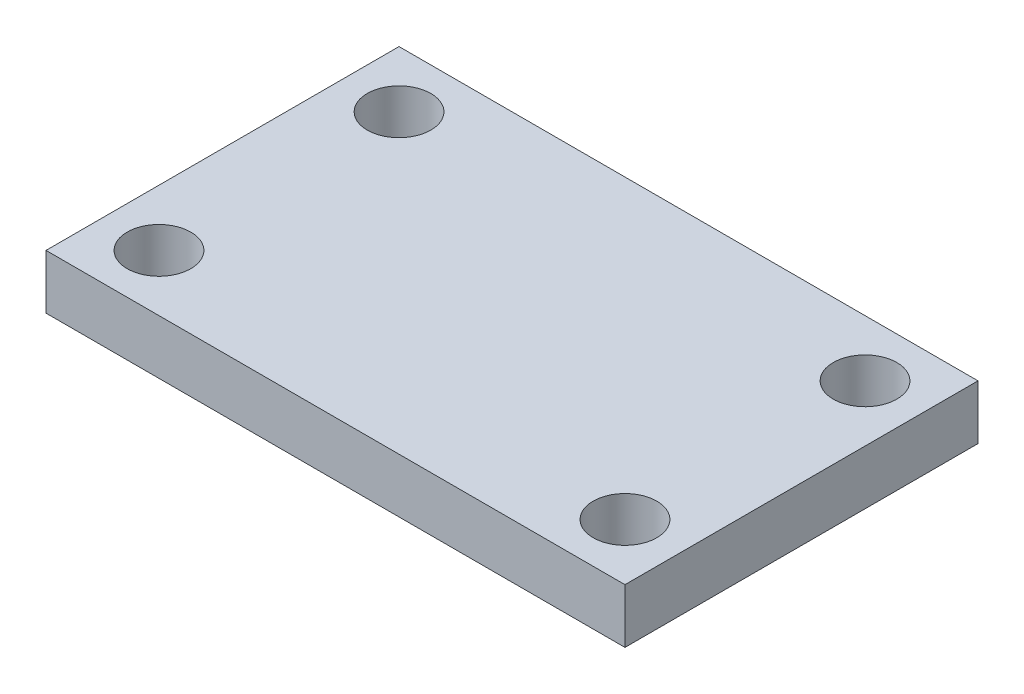
ISO-10303-21;
HEADER;
FILE_DESCRIPTION(('STEP AP214'),'2;1');
FILE_NAME('part.step','',(''),(''),'','','');
FILE_SCHEMA(('AUTOMOTIVE_DESIGN { 1 0 10303 214 1 1 1 1 }'));
ENDSEC;
DATA;
#1=APPLICATION_CONTEXT('core data for automotive mechanical design processes');
#2=APPLICATION_PROTOCOL_DEFINITION('international standard','automotive_design',2000,#1);
#3=PRODUCT_CONTEXT('',#1,'mechanical');
#4=PRODUCT('Part','Part','',(#3));
#5=PRODUCT_RELATED_PRODUCT_CATEGORY('part','',(#4));
#6=PRODUCT_DEFINITION_FORMATION('','',#4);
#7=PRODUCT_DEFINITION_CONTEXT('part definition',#1,'design');
#8=PRODUCT_DEFINITION('design','',#6,#7);
#9=PRODUCT_DEFINITION_SHAPE('','',#8);
#10=(LENGTH_UNIT() NAMED_UNIT(*) SI_UNIT(.MILLI.,.METRE.));
#11=(NAMED_UNIT(*) PLANE_ANGLE_UNIT() SI_UNIT($,.RADIAN.));
#12=(NAMED_UNIT(*) SI_UNIT($,.STERADIAN.) SOLID_ANGLE_UNIT());
#13=UNCERTAINTY_MEASURE_WITH_UNIT(LENGTH_MEASURE(1.E-05),#10,'distance_accuracy_value','');
#14=(GEOMETRIC_REPRESENTATION_CONTEXT(3) GLOBAL_UNCERTAINTY_ASSIGNED_CONTEXT((#13)) GLOBAL_UNIT_ASSIGNED_CONTEXT((#10,
#11,#12)) REPRESENTATION_CONTEXT('',''));
#15=CARTESIAN_POINT('',(0.,0.,0.));
#16=DIRECTION('',(0.,0.,1.));
#17=DIRECTION('',(1.,0.,0.));
#18=AXIS2_PLACEMENT_3D('',#15,#16,#17);
#19=CARTESIAN_POINT('',(-142.584347611488,-317.589072168843,-382.8876));
#20=DIRECTION('',(0.,-1.,0.));
#21=DIRECTION('',(0.,0.,-1.));
#22=AXIS2_PLACEMENT_3D('',#19,#20,#21);
#23=PLANE('',#22);
#24=DIRECTION('',(0.,0.,1.));
#25=VECTOR('',#24,1.);
#26=CARTESIAN_POINT('',(-103.661847611488,-317.589072168843,-506.1739));
#27=LINE('',#26,#25);
#28=CARTESIAN_POINT('',(-103.661847611488,-317.589072168843,-506.1739));
#29=VERTEX_POINT('',#28);
#30=CARTESIAN_POINT('',(-103.661847611488,-317.589072168843,-556.1739));
#31=VERTEX_POINT('',#30);
#32=EDGE_CURVE('E72',#29,#31,#27,.F.);
#33=ORIENTED_EDGE('',*,*,#32,.F.);
#34=DIRECTION('',(1.,0.,0.));
#35=VECTOR('',#34,1.);
#36=CARTESIAN_POINT('',(-21.6618476114882,-317.589072168843,-506.1739));
#37=LINE('',#36,#35);
#38=CARTESIAN_POINT('',(-21.6618476114881,-317.589072168843,-506.1739));
#39=VERTEX_POINT('',#38);
#40=EDGE_CURVE('E55',#39,#29,#37,.F.);
#41=ORIENTED_EDGE('',*,*,#40,.F.);
#42=DIRECTION('',(0.,0.,-1.));
#43=VECTOR('',#42,1.);
#44=CARTESIAN_POINT('',(-21.6618476114881,-317.589072168843,-556.1739));
#45=LINE('',#44,#43);
#46=CARTESIAN_POINT('',(-21.6618476114881,-317.589072168843,-556.1739));
#47=VERTEX_POINT('',#46);
#48=EDGE_CURVE('E60',#47,#39,#45,.F.);
#49=ORIENTED_EDGE('',*,*,#48,.F.);
#50=DIRECTION('',(1.,0.,0.));
#51=VECTOR('',#50,1.);
#52=CARTESIAN_POINT('',(-103.661847611488,-317.589072168843,-556.1739));
#53=LINE('',#52,#51);
#54=EDGE_CURVE('E223',#31,#47,#53,.T.);
#55=ORIENTED_EDGE('',*,*,#54,.F.);
#56=EDGE_LOOP('',(#33,#41,#49,#55));
#57=FACE_BOUND('',#56,.T.);
#58=CARTESIAN_POINT('',(-29.6618476114882,-317.589072168843,-514.1739));
#59=DIRECTION('',(0.,-1.,0.));
#60=DIRECTION('',(0.,0.,-1.));
#61=AXIS2_PLACEMENT_3D('',#58,#59,#60);
#62=CIRCLE('',#61,4.5);
#63=CARTESIAN_POINT('',(-29.6618476114882,-317.589072168843,-518.6739));
#64=VERTEX_POINT('',#63);
#65=EDGE_CURVE('E69',#64,#64,#62,.T.);
#66=ORIENTED_EDGE('',*,*,#65,.T.);
#67=EDGE_LOOP('',(#66));
#68=FACE_BOUND('',#67,.T.);
#69=CARTESIAN_POINT('',(-95.6618476114882,-317.589072168843,-514.1739));
#70=DIRECTION('',(0.,-1.,0.));
#71=DIRECTION('',(0.,0.,-1.));
#72=AXIS2_PLACEMENT_3D('',#69,#70,#71);
#73=CIRCLE('',#72,4.5);
#74=CARTESIAN_POINT('',(-95.6618476114882,-317.589072168843,-518.6739));
#75=VERTEX_POINT('',#74);
#76=EDGE_CURVE('E98',#75,#75,#73,.T.);
#77=ORIENTED_EDGE('',*,*,#76,.T.);
#78=EDGE_LOOP('',(#77));
#79=FACE_BOUND('',#78,.T.);
#80=CARTESIAN_POINT('',(-95.6618476114881,-317.589072168843,-548.1739));
#81=DIRECTION('',(0.,-1.,0.));
#82=DIRECTION('',(0.,0.,-1.));
#83=AXIS2_PLACEMENT_3D('',#80,#81,#82);
#84=CIRCLE('',#83,4.5);
#85=CARTESIAN_POINT('',(-95.6618476114881,-317.589072168843,-552.6739));
#86=VERTEX_POINT('',#85);
#87=EDGE_CURVE('E100',#86,#86,#84,.T.);
#88=ORIENTED_EDGE('',*,*,#87,.T.);
#89=EDGE_LOOP('',(#88));
#90=FACE_BOUND('',#89,.T.);
#91=CARTESIAN_POINT('',(-29.6618476114881,-317.589072168843,-548.1739));
#92=DIRECTION('',(0.,-1.,0.));
#93=DIRECTION('',(0.,0.,-1.));
#94=AXIS2_PLACEMENT_3D('',#91,#92,#93);
#95=CIRCLE('',#94,4.5);
#96=CARTESIAN_POINT('',(-29.6618476114881,-317.589072168843,-552.6739));
#97=VERTEX_POINT('',#96);
#98=EDGE_CURVE('E20',#97,#97,#95,.T.);
#99=ORIENTED_EDGE('',*,*,#98,.T.);
#100=EDGE_LOOP('',(#99));
#101=FACE_BOUND('',#100,.T.);
#102=ADVANCED_FACE('F17',(#57,#68,#79,#90,#101),#23,.F.);
#103=CARTESIAN_POINT('',(-29.6618476114881,-321.310072168843,-548.1739));
#104=DIRECTION('',(0.,-1.,0.));
#105=DIRECTION('',(0.,0.,-1.));
#106=AXIS2_PLACEMENT_3D('',#103,#104,#105);
#107=CYLINDRICAL_SURFACE('',#106,4.5);
#108=CARTESIAN_POINT('',(-29.6618476114881,-325.289072168843,-548.1739));
#109=DIRECTION('',(0.,-1.,0.));
#110=DIRECTION('',(0.,0.,-1.));
#111=AXIS2_PLACEMENT_3D('',#108,#109,#110);
#112=CIRCLE('',#111,4.5);
#113=CARTESIAN_POINT('',(-29.6618476114881,-325.289072168843,-552.6739));
#114=VERTEX_POINT('',#113);
#115=EDGE_CURVE('E93',#114,#114,#112,.F.);
#116=ORIENTED_EDGE('',*,*,#115,.F.);
#117=EDGE_LOOP('',(#116));
#118=FACE_BOUND('',#117,.T.);
#119=ORIENTED_EDGE('',*,*,#98,.F.);
#120=EDGE_LOOP('',(#119));
#121=FACE_BOUND('',#120,.T.);
#122=ADVANCED_FACE('F108',(#118,#121),#107,.F.);
#123=CARTESIAN_POINT('',(-95.6618476114881,-321.310072168843,-548.1739));
#124=DIRECTION('',(0.,-1.,0.));
#125=DIRECTION('',(0.,0.,-1.));
#126=AXIS2_PLACEMENT_3D('',#123,#124,#125);
#127=CYLINDRICAL_SURFACE('',#126,4.5);
#128=CARTESIAN_POINT('',(-95.6618476114881,-325.289072168843,-548.1739));
#129=DIRECTION('',(0.,-1.,0.));
#130=DIRECTION('',(0.,0.,-1.));
#131=AXIS2_PLACEMENT_3D('',#128,#129,#130);
#132=CIRCLE('',#131,4.5);
#133=CARTESIAN_POINT('',(-95.6618476114881,-325.289072168843,-552.6739));
#134=VERTEX_POINT('',#133);
#135=EDGE_CURVE('E90',#134,#134,#132,.F.);
#136=ORIENTED_EDGE('',*,*,#135,.F.);
#137=EDGE_LOOP('',(#136));
#138=FACE_BOUND('',#137,.T.);
#139=ORIENTED_EDGE('',*,*,#87,.F.);
#140=EDGE_LOOP('',(#139));
#141=FACE_BOUND('',#140,.T.);
#142=ADVANCED_FACE('F110',(#138,#141),#127,.F.);
#143=CARTESIAN_POINT('',(-95.6618476114882,-321.310072168843,-514.1739));
#144=DIRECTION('',(0.,-1.,0.));
#145=DIRECTION('',(0.,0.,-1.));
#146=AXIS2_PLACEMENT_3D('',#143,#144,#145);
#147=CYLINDRICAL_SURFACE('',#146,4.5);
#148=CARTESIAN_POINT('',(-95.6618476114882,-325.289072168843,-514.1739));
#149=DIRECTION('',(0.,-1.,0.));
#150=DIRECTION('',(0.,0.,-1.));
#151=AXIS2_PLACEMENT_3D('',#148,#149,#150);
#152=CIRCLE('',#151,4.5);
#153=CARTESIAN_POINT('',(-95.6618476114882,-325.289072168843,-518.6739));
#154=VERTEX_POINT('',#153);
#155=EDGE_CURVE('E87',#154,#154,#152,.F.);
#156=ORIENTED_EDGE('',*,*,#155,.F.);
#157=EDGE_LOOP('',(#156));
#158=FACE_BOUND('',#157,.T.);
#159=ORIENTED_EDGE('',*,*,#76,.F.);
#160=EDGE_LOOP('',(#159));
#161=FACE_BOUND('',#160,.T.);
#162=ADVANCED_FACE('F117',(#158,#161),#147,.F.);
#163=CARTESIAN_POINT('',(-29.6618476114882,-321.310072168843,-514.1739));
#164=DIRECTION('',(0.,-1.,0.));
#165=DIRECTION('',(0.,0.,-1.));
#166=AXIS2_PLACEMENT_3D('',#163,#164,#165);
#167=CYLINDRICAL_SURFACE('',#166,4.5);
#168=ORIENTED_EDGE('',*,*,#65,.F.);
#169=EDGE_LOOP('',(#168));
#170=FACE_BOUND('',#169,.T.);
#171=CARTESIAN_POINT('',(-29.6618476114882,-325.289072168843,-514.1739));
#172=DIRECTION('',(0.,-1.,0.));
#173=DIRECTION('',(0.,0.,-1.));
#174=AXIS2_PLACEMENT_3D('',#171,#172,#173);
#175=CIRCLE('',#174,4.5);
#176=CARTESIAN_POINT('',(-29.6618476114882,-325.289072168843,-518.6739));
#177=VERTEX_POINT('',#176);
#178=EDGE_CURVE('E83',#177,#177,#175,.F.);
#179=ORIENTED_EDGE('',*,*,#178,.F.);
#180=EDGE_LOOP('',(#179));
#181=FACE_BOUND('',#180,.T.);
#182=ADVANCED_FACE('F141',(#170,#181),#167,.F.);
#183=CARTESIAN_POINT('',(-21.6618476114881,-321.310072168843,-556.1739));
#184=DIRECTION('',(1.,0.,0.));
#185=DIRECTION('',(0.,0.,-1.));
#186=AXIS2_PLACEMENT_3D('',#183,#184,#185);
#187=PLANE('',#186);
#188=ORIENTED_EDGE('',*,*,#48,.T.);
#189=DIRECTION('',(0.,-1.,0.));
#190=VECTOR('',#189,1.);
#191=CARTESIAN_POINT('',(-21.6618476114882,-321.310072168843,-506.1739));
#192=LINE('',#191,#190);
#193=CARTESIAN_POINT('',(-21.6618476114881,-325.289072168843,-506.1739));
#194=VERTEX_POINT('',#193);
#195=EDGE_CURVE('E62',#194,#39,#192,.F.);
#196=ORIENTED_EDGE('',*,*,#195,.F.);
#197=DIRECTION('',(0.,0.,-1.));
#198=VECTOR('',#197,1.);
#199=CARTESIAN_POINT('',(-21.6618476114881,-325.289072168843,-135.95));
#200=LINE('',#199,#198);
#201=CARTESIAN_POINT('',(-21.6618476114881,-325.289072168843,-556.1739));
#202=VERTEX_POINT('',#201);
#203=EDGE_CURVE('E86',#202,#194,#200,.F.);
#204=ORIENTED_EDGE('',*,*,#203,.F.);
#205=DIRECTION('',(0.,1.,0.));
#206=VECTOR('',#205,1.);
#207=CARTESIAN_POINT('',(-21.6618476114881,-321.310072168843,-556.1739));
#208=LINE('',#207,#206);
#209=EDGE_CURVE('E65',#47,#202,#208,.F.);
#210=ORIENTED_EDGE('',*,*,#209,.F.);
#211=EDGE_LOOP('',(#188,#196,#204,#210));
#212=FACE_BOUND('',#211,.T.);
#213=ADVANCED_FACE('F61',(#212),#187,.T.);
#214=CARTESIAN_POINT('',(-21.6618476114882,-321.310072168843,-506.1739));
#215=DIRECTION('',(0.,0.,1.));
#216=DIRECTION('',(0.,-1.,0.));
#217=AXIS2_PLACEMENT_3D('',#214,#215,#216);
#218=PLANE('',#217);
#219=ORIENTED_EDGE('',*,*,#40,.T.);
#220=DIRECTION('',(0.,1.,0.));
#221=VECTOR('',#220,1.);
#222=CARTESIAN_POINT('',(-103.661847611488,-321.310072168843,-506.1739));
#223=LINE('',#222,#221);
#224=CARTESIAN_POINT('',(-103.661847611488,-325.289072168843,-506.1739));
#225=VERTEX_POINT('',#224);
#226=EDGE_CURVE('E74',#225,#29,#223,.T.);
#227=ORIENTED_EDGE('',*,*,#226,.F.);
#228=DIRECTION('',(1.,0.,0.));
#229=VECTOR('',#228,1.);
#230=CARTESIAN_POINT('',(-173.489347611488,-325.289072168843,-506.1739));
#231=LINE('',#230,#229);
#232=EDGE_CURVE('E78',#194,#225,#231,.F.);
#233=ORIENTED_EDGE('',*,*,#232,.F.);
#234=ORIENTED_EDGE('',*,*,#195,.T.);
#235=EDGE_LOOP('',(#219,#227,#233,#234));
#236=FACE_BOUND('',#235,.T.);
#237=ADVANCED_FACE('F76',(#236),#218,.T.);
#238=CARTESIAN_POINT('',(-103.661847611488,-321.310072168843,-506.1739));
#239=DIRECTION('',(-1.,0.,0.));
#240=DIRECTION('',(0.,0.,1.));
#241=AXIS2_PLACEMENT_3D('',#238,#239,#240);
#242=PLANE('',#241);
#243=ORIENTED_EDGE('',*,*,#32,.T.);
#244=DIRECTION('',(0.,1.,0.));
#245=VECTOR('',#244,1.);
#246=CARTESIAN_POINT('',(-103.661847611488,-321.310072168843,-556.1739));
#247=LINE('',#246,#245);
#248=CARTESIAN_POINT('',(-103.661847611488,-325.289072168843,-556.1739));
#249=VERTEX_POINT('',#248);
#250=EDGE_CURVE('E35',#249,#31,#247,.T.);
#251=ORIENTED_EDGE('',*,*,#250,.F.);
#252=DIRECTION('',(0.,0.,-1.));
#253=VECTOR('',#252,1.);
#254=CARTESIAN_POINT('',(-103.661847611488,-325.289072168843,-135.95));
#255=LINE('',#254,#253);
#256=EDGE_CURVE('E26',#225,#249,#255,.T.);
#257=ORIENTED_EDGE('',*,*,#256,.F.);
#258=ORIENTED_EDGE('',*,*,#226,.T.);
#259=EDGE_LOOP('',(#243,#251,#257,#258));
#260=FACE_BOUND('',#259,.T.);
#261=ADVANCED_FACE('F129',(#260),#242,.T.);
#262=CARTESIAN_POINT('',(-103.661847611488,-321.310072168843,-556.1739));
#263=DIRECTION('',(0.,0.,-1.));
#264=DIRECTION('',(0.,1.,0.));
#265=AXIS2_PLACEMENT_3D('',#262,#263,#264);
#266=PLANE('',#265);
#267=ORIENTED_EDGE('',*,*,#54,.T.);
#268=ORIENTED_EDGE('',*,*,#209,.T.);
#269=DIRECTION('',(1.,0.,0.));
#270=VECTOR('',#269,1.);
#271=CARTESIAN_POINT('',(-173.489347611488,-325.289072168843,-556.1739));
#272=LINE('',#271,#270);
#273=EDGE_CURVE('E11',#249,#202,#272,.T.);
#274=ORIENTED_EDGE('',*,*,#273,.F.);
#275=ORIENTED_EDGE('',*,*,#250,.T.);
#276=EDGE_LOOP('',(#267,#268,#274,#275));
#277=FACE_BOUND('',#276,.T.);
#278=ADVANCED_FACE('F123',(#277),#266,.T.);
#279=CARTESIAN_POINT('',(-173.489347611488,-325.289072168843,-135.95));
#280=DIRECTION('',(0.,-1.,0.));
#281=DIRECTION('',(0.,0.,-1.));
#282=AXIS2_PLACEMENT_3D('',#279,#280,#281);
#283=PLANE('',#282);
#284=ORIENTED_EDGE('',*,*,#256,.T.);
#285=ORIENTED_EDGE('',*,*,#273,.T.);
#286=ORIENTED_EDGE('',*,*,#203,.T.);
#287=ORIENTED_EDGE('',*,*,#232,.T.);
#288=EDGE_LOOP('',(#284,#285,#286,#287));
#289=FACE_BOUND('',#288,.T.);
#290=ORIENTED_EDGE('',*,*,#178,.T.);
#291=EDGE_LOOP('',(#290));
#292=FACE_BOUND('',#291,.T.);
#293=ORIENTED_EDGE('',*,*,#155,.T.);
#294=EDGE_LOOP('',(#293));
#295=FACE_BOUND('',#294,.T.);
#296=ORIENTED_EDGE('',*,*,#135,.T.);
#297=EDGE_LOOP('',(#296));
#298=FACE_BOUND('',#297,.T.);
#299=ORIENTED_EDGE('',*,*,#115,.T.);
#300=EDGE_LOOP('',(#299));
#301=FACE_BOUND('',#300,.T.);
#302=ADVANCED_FACE('F121',(#289,#292,#295,#298,#301),#283,.T.);
#303=CLOSED_SHELL('',(#102,#122,#142,#162,#182,#213,#237,#261,#278,#302));
#304=MANIFOLD_SOLID_BREP('B1',#303);
#305=ADVANCED_BREP_SHAPE_REPRESENTATION('',(#18,#304),#14);
#306=SHAPE_DEFINITION_REPRESENTATION(#9,#305);
ENDSEC;
END-ISO-10303-21;
